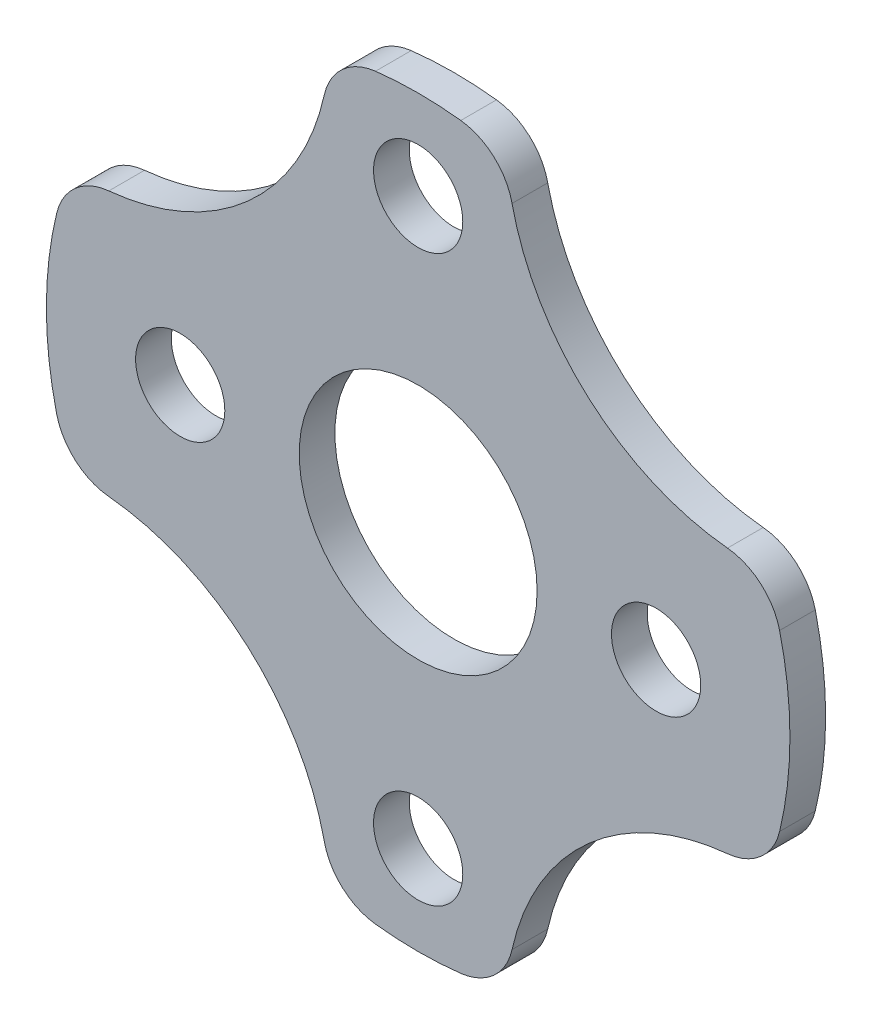
ISO-10303-21;
HEADER;
FILE_DESCRIPTION(('STEP AP214'),'2;1');
FILE_NAME('part.step','',(''),(''),'','','');
FILE_SCHEMA(('AUTOMOTIVE_DESIGN { 1 0 10303 214 1 1 1 1 }'));
ENDSEC;
DATA;
#1=APPLICATION_CONTEXT('core data for automotive mechanical design processes');
#2=APPLICATION_PROTOCOL_DEFINITION('international standard','automotive_design',2000,#1);
#3=PRODUCT_CONTEXT('',#1,'mechanical');
#4=PRODUCT('Part','Part','',(#3));
#5=PRODUCT_RELATED_PRODUCT_CATEGORY('part','',(#4));
#6=PRODUCT_DEFINITION_FORMATION('','',#4);
#7=PRODUCT_DEFINITION_CONTEXT('part definition',#1,'design');
#8=PRODUCT_DEFINITION('design','',#6,#7);
#9=PRODUCT_DEFINITION_SHAPE('','',#8);
#10=(LENGTH_UNIT() NAMED_UNIT(*) SI_UNIT(.MILLI.,.METRE.));
#11=(NAMED_UNIT(*) PLANE_ANGLE_UNIT() SI_UNIT($,.RADIAN.));
#12=(NAMED_UNIT(*) SI_UNIT($,.STERADIAN.) SOLID_ANGLE_UNIT());
#13=UNCERTAINTY_MEASURE_WITH_UNIT(LENGTH_MEASURE(1.E-05),#10,'distance_accuracy_value','');
#14=(GEOMETRIC_REPRESENTATION_CONTEXT(3) GLOBAL_UNCERTAINTY_ASSIGNED_CONTEXT((#13)) GLOBAL_UNIT_ASSIGNED_CONTEXT((#10,
#11,#12)) REPRESENTATION_CONTEXT('',''));
#15=CARTESIAN_POINT('',(0.,0.,0.));
#16=DIRECTION('',(0.,0.,1.));
#17=DIRECTION('',(1.,0.,0.));
#18=AXIS2_PLACEMENT_3D('',#15,#16,#17);
#19=CARTESIAN_POINT('',(-62.7493060624374,7.4838621909329,1.2));
#20=DIRECTION('',(0.,0.,-1.));
#21=DIRECTION('',(-1.,0.,0.));
#22=AXIS2_PLACEMENT_3D('',#19,#20,#21);
#23=CYLINDRICAL_SURFACE('',#22,12.5);
#24=CARTESIAN_POINT('',(-62.7493060624374,7.4838621909329,0.));
#25=DIRECTION('',(0.,0.,1.));
#26=DIRECTION('',(1.,0.,0.));
#27=AXIS2_PLACEMENT_3D('',#24,#25,#26);
#28=CIRCLE('',#27,12.5);
#29=CARTESIAN_POINT('',(-64.1831600083881,-4.93362800884907,0.));
#30=VERTEX_POINT('',#29);
#31=CARTESIAN_POINT('',(-61.3154521164866,-4.93362800884907,0.));
#32=VERTEX_POINT('',#31);
#33=EDGE_CURVE('E178',#30,#32,#28,.T.);
#34=ORIENTED_EDGE('',*,*,#33,.T.);
#35=DIRECTION('',(0.,0.,-1.));
#36=VECTOR('',#35,1.);
#37=CARTESIAN_POINT('',(-61.3154521164866,-4.93362800884907,1.2));
#38=LINE('',#37,#36);
#39=CARTESIAN_POINT('',(-61.3154521164866,-4.93362800884907,1.2));
#40=VERTEX_POINT('',#39);
#41=EDGE_CURVE('E259',#32,#40,#38,.F.);
#42=ORIENTED_EDGE('',*,*,#41,.T.);
#43=CARTESIAN_POINT('',(-62.7493060624374,7.4838621909329,1.2));
#44=DIRECTION('',(0.,0.,1.));
#45=DIRECTION('',(1.,0.,0.));
#46=AXIS2_PLACEMENT_3D('',#43,#44,#45);
#47=CIRCLE('',#46,12.5);
#48=CARTESIAN_POINT('',(-64.1831600083881,-4.93362800884907,1.2));
#49=VERTEX_POINT('',#48);
#50=EDGE_CURVE('E204',#49,#40,#47,.T.);
#51=ORIENTED_EDGE('',*,*,#50,.F.);
#52=DIRECTION('',(0.,0.,-1.));
#53=VECTOR('',#52,1.);
#54=CARTESIAN_POINT('',(-64.1831600083881,-4.93362800884907,1.2));
#55=LINE('',#54,#53);
#56=EDGE_CURVE('E256',#49,#30,#55,.T.);
#57=ORIENTED_EDGE('',*,*,#56,.T.);
#58=EDGE_LOOP('',(#34,#42,#51,#57));
#59=FACE_BOUND('',#58,.T.);
#60=ADVANCED_FACE('F33',(#59),#23,.T.);
#61=CARTESIAN_POINT('',(-74.9017818269291,10.4108628389414,1.2));
#62=VERTEX_POINT('',#61);
#63=CARTESIAN_POINT('',(-74.9017818269291,4.55686154292442,1.2));
#64=VERTEX_POINT('',#63);
#65=EDGE_CURVE('E169',#62,#64,#47,.T.);
#66=ORIENTED_EDGE('',*,*,#65,.F.);
#67=DIRECTION('',(0.,0.,-1.));
#68=VECTOR('',#67,1.);
#69=CARTESIAN_POINT('',(-74.9017818269291,10.4108628389414,1.2));
#70=LINE('',#69,#68);
#71=CARTESIAN_POINT('',(-74.9017818269291,10.4108628389414,0.));
#72=VERTEX_POINT('',#71);
#73=EDGE_CURVE('E152',#62,#72,#70,.T.);
#74=ORIENTED_EDGE('',*,*,#73,.T.);
#75=CARTESIAN_POINT('',(-74.9017818269291,4.55686154292442,0.));
#76=VERTEX_POINT('',#75);
#77=EDGE_CURVE('E166',#72,#76,#28,.T.);
#78=ORIENTED_EDGE('',*,*,#77,.T.);
#79=DIRECTION('',(0.,0.,-1.));
#80=VECTOR('',#79,1.);
#81=CARTESIAN_POINT('',(-74.9017818269291,4.55686154292442,1.2));
#82=LINE('',#81,#80);
#83=EDGE_CURVE('E171',#76,#64,#82,.F.);
#84=ORIENTED_EDGE('',*,*,#83,.T.);
#85=EDGE_LOOP('',(#66,#74,#78,#84));
#86=FACE_BOUND('',#85,.T.);
#87=ADVANCED_FACE('F164',(#86),#23,.T.);
#88=CARTESIAN_POINT('',(-61.3154521164866,19.9013523907149,0.));
#89=VERTEX_POINT('',#88);
#90=CARTESIAN_POINT('',(-64.1831600083881,19.9013523907149,0.));
#91=VERTEX_POINT('',#90);
#92=EDGE_CURVE('E177',#89,#91,#28,.T.);
#93=ORIENTED_EDGE('',*,*,#92,.T.);
#94=DIRECTION('',(0.,0.,-1.));
#95=VECTOR('',#94,1.);
#96=CARTESIAN_POINT('',(-64.1831600083881,19.9013523907149,1.2));
#97=LINE('',#96,#95);
#98=CARTESIAN_POINT('',(-64.1831600083881,19.9013523907149,1.2));
#99=VERTEX_POINT('',#98);
#100=EDGE_CURVE('E241',#91,#99,#97,.F.);
#101=ORIENTED_EDGE('',*,*,#100,.T.);
#102=CARTESIAN_POINT('',(-61.3154521164866,19.9013523907149,1.2));
#103=VERTEX_POINT('',#102);
#104=EDGE_CURVE('E205',#103,#99,#47,.T.);
#105=ORIENTED_EDGE('',*,*,#104,.F.);
#106=DIRECTION('',(0.,0.,-1.));
#107=VECTOR('',#106,1.);
#108=CARTESIAN_POINT('',(-61.3154521164866,19.9013523907149,1.2));
#109=LINE('',#108,#107);
#110=EDGE_CURVE('E238',#103,#89,#109,.T.);
#111=ORIENTED_EDGE('',*,*,#110,.T.);
#112=EDGE_LOOP('',(#93,#101,#105,#111));
#113=FACE_BOUND('',#112,.T.);
#114=ADVANCED_FACE('F336',(#113),#23,.T.);
#115=CARTESIAN_POINT('',(-62.7493060624374,7.4838621909329,1.2));
#116=DIRECTION('',(0.,0.,1.));
#117=DIRECTION('',(1.,0.,0.));
#118=AXIS2_PLACEMENT_3D('',#115,#116,#117);
#119=PLANE('',#118);
#120=CARTESIAN_POINT('',(-73.9402170270319,20.1229512263385,1.2));
#121=DIRECTION('',(0.,0.,1.));
#122=DIRECTION('',(1.,0.,0.));
#123=AXIS2_PLACEMENT_3D('',#120,#121,#122);
#124=CIRCLE('',#123,8.2277404373378);
#125=CARTESIAN_POINT('',(-73.1495750407483,11.9332871334877,1.2));
#126=VERTEX_POINT('',#125);
#127=CARTESIAN_POINT('',(-65.9065644739694,18.3463985643337,1.2));
#128=VERTEX_POINT('',#127);
#129=EDGE_CURVE('E277',#126,#128,#124,.T.);
#130=ORIENTED_EDGE('',*,*,#129,.F.);
#131=CARTESIAN_POINT('',(-72.9573857046104,9.94254273526002,1.2));
#132=DIRECTION('',(0.,0.,1.));
#133=DIRECTION('',(1.,0.,0.));
#134=AXIS2_PLACEMENT_3D('',#131,#132,#133);
#135=CIRCLE('',#134,2.);
#136=EDGE_CURVE('E236',#126,#62,#135,.T.);
#137=ORIENTED_EDGE('',*,*,#136,.T.);
#138=ORIENTED_EDGE('',*,*,#65,.T.);
#139=CARTESIAN_POINT('',(-72.9573857046104,5.02518164660578,1.2));
#140=DIRECTION('',(0.,0.,1.));
#141=DIRECTION('',(1.,0.,0.));
#142=AXIS2_PLACEMENT_3D('',#139,#140,#141);
#143=CIRCLE('',#142,2.);
#144=CARTESIAN_POINT('',(-73.1495750407483,3.03443724837811,1.2));
#145=VERTEX_POINT('',#144);
#146=EDGE_CURVE('E224',#64,#145,#143,.T.);
#147=ORIENTED_EDGE('',*,*,#146,.T.);
#148=CARTESIAN_POINT('',(-73.9402170270319,-5.15522684447266,1.2));
#149=DIRECTION('',(0.,0.,1.));
#150=DIRECTION('',(1.,0.,0.));
#151=AXIS2_PLACEMENT_3D('',#148,#149,#150);
#152=CIRCLE('',#151,8.2277404373378);
#153=CARTESIAN_POINT('',(-65.9065644739694,-3.37867418246793,1.2));
#154=VERTEX_POINT('',#153);
#155=EDGE_CURVE('E267',#154,#145,#152,.T.);
#156=ORIENTED_EDGE('',*,*,#155,.F.);
#157=CARTESIAN_POINT('',(-63.953743377036,-2.94682957688395,1.2));
#158=DIRECTION('',(0.,0.,1.));
#159=DIRECTION('',(1.,0.,0.));
#160=AXIS2_PLACEMENT_3D('',#157,#158,#159);
#161=CIRCLE('',#160,2.);
#162=EDGE_CURVE('E56',#154,#49,#161,.T.);
#163=ORIENTED_EDGE('',*,*,#162,.T.);
#164=ORIENTED_EDGE('',*,*,#50,.T.);
#165=CARTESIAN_POINT('',(-61.5448687478387,-2.94682957688395,1.2));
#166=DIRECTION('',(0.,0.,1.));
#167=DIRECTION('',(1.,0.,0.));
#168=AXIS2_PLACEMENT_3D('',#165,#166,#167);
#169=CIRCLE('',#168,2.);
#170=CARTESIAN_POINT('',(-59.5920476509054,-3.37867418246793,1.2));
#171=VERTEX_POINT('',#170);
#172=EDGE_CURVE('E48',#40,#171,#169,.T.);
#173=ORIENTED_EDGE('',*,*,#172,.T.);
#174=CARTESIAN_POINT('',(-51.5583950978429,-5.15522684447264,1.2));
#175=DIRECTION('',(0.,0.,1.));
#176=DIRECTION('',(1.,0.,0.));
#177=AXIS2_PLACEMENT_3D('',#174,#175,#176);
#178=CIRCLE('',#177,8.22774043733777);
#179=CARTESIAN_POINT('',(-52.3490370841264,3.0344372483781,1.2));
#180=VERTEX_POINT('',#179);
#181=EDGE_CURVE('E282',#180,#171,#178,.T.);
#182=ORIENTED_EDGE('',*,*,#181,.F.);
#183=CARTESIAN_POINT('',(-52.5412264202643,5.02518164660578,1.2));
#184=DIRECTION('',(0.,0.,1.));
#185=DIRECTION('',(1.,0.,0.));
#186=AXIS2_PLACEMENT_3D('',#183,#184,#185);
#187=CIRCLE('',#186,2.);
#188=CARTESIAN_POINT('',(-50.5968302979457,4.55686154292442,1.2));
#189=VERTEX_POINT('',#188);
#190=EDGE_CURVE('E228',#180,#189,#187,.T.);
#191=ORIENTED_EDGE('',*,*,#190,.T.);
#192=CARTESIAN_POINT('',(-50.5968302979457,10.4108628389414,1.2));
#193=VERTEX_POINT('',#192);
#194=EDGE_CURVE('E182',#189,#193,#47,.T.);
#195=ORIENTED_EDGE('',*,*,#194,.T.);
#196=CARTESIAN_POINT('',(-52.5412264202643,9.94254273526003,1.2));
#197=DIRECTION('',(0.,0.,1.));
#198=DIRECTION('',(1.,0.,0.));
#199=AXIS2_PLACEMENT_3D('',#196,#197,#198);
#200=CIRCLE('',#199,2.);
#201=CARTESIAN_POINT('',(-52.3490370841264,11.9332871334877,1.2));
#202=VERTEX_POINT('',#201);
#203=EDGE_CURVE('E230',#193,#202,#200,.T.);
#204=ORIENTED_EDGE('',*,*,#203,.T.);
#205=CARTESIAN_POINT('',(-51.5583950978429,20.1229512263385,1.2));
#206=DIRECTION('',(0.,0.,1.));
#207=DIRECTION('',(1.,0.,0.));
#208=AXIS2_PLACEMENT_3D('',#205,#206,#207);
#209=CIRCLE('',#208,8.22774043733779);
#210=CARTESIAN_POINT('',(-59.5920476509053,18.3463985643337,1.2));
#211=VERTEX_POINT('',#210);
#212=EDGE_CURVE('E280',#211,#202,#209,.T.);
#213=ORIENTED_EDGE('',*,*,#212,.F.);
#214=CARTESIAN_POINT('',(-61.5448687478387,17.9145539587498,1.2));
#215=DIRECTION('',(0.,0.,1.));
#216=DIRECTION('',(1.,0.,0.));
#217=AXIS2_PLACEMENT_3D('',#214,#215,#216);
#218=CIRCLE('',#217,2.);
#219=EDGE_CURVE('E232',#211,#103,#218,.T.);
#220=ORIENTED_EDGE('',*,*,#219,.T.);
#221=ORIENTED_EDGE('',*,*,#104,.T.);
#222=CARTESIAN_POINT('',(-63.953743377036,17.9145539587498,1.2));
#223=DIRECTION('',(0.,0.,1.));
#224=DIRECTION('',(1.,0.,0.));
#225=AXIS2_PLACEMENT_3D('',#222,#223,#224);
#226=CIRCLE('',#225,2.);
#227=EDGE_CURVE('E234',#99,#128,#226,.T.);
#228=ORIENTED_EDGE('',*,*,#227,.T.);
#229=EDGE_LOOP('',(#130,#137,#138,#147,#156,#163,#164,#173,#182,#191,#195,#204,#213,#220,#221,#228));
#230=FACE_BOUND('',#229,.T.);
#231=CARTESIAN_POINT('',(-62.7493060624374,-2.0161378090671,1.2));
#232=DIRECTION('',(0.,0.,1.));
#233=DIRECTION('',(1.,0.,0.));
#234=AXIS2_PLACEMENT_3D('',#231,#232,#233);
#235=CIRCLE('',#234,1.5);
#236=CARTESIAN_POINT('',(-61.2493060624374,-2.0161378090671,1.2));
#237=VERTEX_POINT('',#236);
#238=EDGE_CURVE('E298',#237,#237,#235,.T.);
#239=ORIENTED_EDGE('',*,*,#238,.F.);
#240=EDGE_LOOP('',(#239));
#241=FACE_BOUND('',#240,.T.);
#242=CARTESIAN_POINT('',(-54.7493060624374,7.4838621909329,1.2));
#243=DIRECTION('',(0.,0.,1.));
#244=DIRECTION('',(1.,0.,0.));
#245=AXIS2_PLACEMENT_3D('',#242,#243,#244);
#246=CIRCLE('',#245,1.5);
#247=CARTESIAN_POINT('',(-53.2493060624374,7.4838621909329,1.2));
#248=VERTEX_POINT('',#247);
#249=EDGE_CURVE('E199',#248,#248,#246,.T.);
#250=ORIENTED_EDGE('',*,*,#249,.F.);
#251=EDGE_LOOP('',(#250));
#252=FACE_BOUND('',#251,.T.);
#253=CARTESIAN_POINT('',(-70.7493060624374,7.4838621909329,1.2));
#254=DIRECTION('',(0.,0.,1.));
#255=DIRECTION('',(1.,0.,0.));
#256=AXIS2_PLACEMENT_3D('',#253,#254,#255);
#257=CIRCLE('',#256,1.5);
#258=CARTESIAN_POINT('',(-69.2493060624374,7.4838621909329,1.2));
#259=VERTEX_POINT('',#258);
#260=EDGE_CURVE('E187',#259,#259,#257,.T.);
#261=ORIENTED_EDGE('',*,*,#260,.F.);
#262=EDGE_LOOP('',(#261));
#263=FACE_BOUND('',#262,.T.);
#264=CARTESIAN_POINT('',(-62.7493060624374,16.9838621909329,1.2));
#265=DIRECTION('',(0.,0.,1.));
#266=DIRECTION('',(1.,0.,0.));
#267=AXIS2_PLACEMENT_3D('',#264,#265,#266);
#268=CIRCLE('',#267,1.5);
#269=CARTESIAN_POINT('',(-61.2493060624374,16.9838621909329,1.2));
#270=VERTEX_POINT('',#269);
#271=EDGE_CURVE('E304',#270,#270,#268,.T.);
#272=ORIENTED_EDGE('',*,*,#271,.F.);
#273=EDGE_LOOP('',(#272));
#274=FACE_BOUND('',#273,.T.);
#275=CARTESIAN_POINT('',(-62.7493060624374,7.4838621909329,1.2));
#276=DIRECTION('',(0.,0.,1.));
#277=DIRECTION('',(1.,0.,0.));
#278=AXIS2_PLACEMENT_3D('',#275,#276,#277);
#279=CIRCLE('',#278,4.00000000000001);
#280=CARTESIAN_POINT('',(-58.7493060624374,7.4838621909329,1.2));
#281=VERTEX_POINT('',#280);
#282=EDGE_CURVE('E292',#281,#281,#279,.T.);
#283=ORIENTED_EDGE('',*,*,#282,.F.);
#284=EDGE_LOOP('',(#283));
#285=FACE_BOUND('',#284,.T.);
#286=ADVANCED_FACE('F274',(#230,#241,#252,#263,#274,#285),#119,.T.);
#287=CARTESIAN_POINT('',(-62.7493060624374,7.4838621909329,0.));
#288=DIRECTION('',(0.,0.,1.));
#289=DIRECTION('',(1.,0.,0.));
#290=AXIS2_PLACEMENT_3D('',#287,#288,#289);
#291=PLANE('',#290);
#292=ORIENTED_EDGE('',*,*,#77,.F.);
#293=CARTESIAN_POINT('',(-72.9573857046104,9.94254273526002,0.));
#294=DIRECTION('',(0.,0.,1.));
#295=DIRECTION('',(1.,0.,0.));
#296=AXIS2_PLACEMENT_3D('',#293,#294,#295);
#297=CIRCLE('',#296,2.);
#298=CARTESIAN_POINT('',(-73.1495750407483,11.9332871334877,0.));
#299=VERTEX_POINT('',#298);
#300=EDGE_CURVE('E148',#72,#299,#297,.F.);
#301=ORIENTED_EDGE('',*,*,#300,.T.);
#302=CARTESIAN_POINT('',(-73.9402170270319,20.1229512263385,0.));
#303=DIRECTION('',(0.,0.,-1.));
#304=DIRECTION('',(1.,0.,0.));
#305=AXIS2_PLACEMENT_3D('',#302,#303,#304);
#306=CIRCLE('',#305,8.2277404373378);
#307=CARTESIAN_POINT('',(-65.9065644739694,18.3463985643337,0.));
#308=VERTEX_POINT('',#307);
#309=EDGE_CURVE('E270',#308,#299,#306,.T.);
#310=ORIENTED_EDGE('',*,*,#309,.F.);
#311=CARTESIAN_POINT('',(-63.953743377036,17.9145539587498,0.));
#312=DIRECTION('',(0.,0.,1.));
#313=DIRECTION('',(1.,0.,0.));
#314=AXIS2_PLACEMENT_3D('',#311,#312,#313);
#315=CIRCLE('',#314,2.);
#316=EDGE_CURVE('E159',#308,#91,#315,.F.);
#317=ORIENTED_EDGE('',*,*,#316,.T.);
#318=ORIENTED_EDGE('',*,*,#92,.F.);
#319=CARTESIAN_POINT('',(-61.5448687478387,17.9145539587498,0.));
#320=DIRECTION('',(0.,0.,1.));
#321=DIRECTION('',(1.,0.,0.));
#322=AXIS2_PLACEMENT_3D('',#319,#320,#321);
#323=CIRCLE('',#322,2.);
#324=CARTESIAN_POINT('',(-59.5920476509053,18.3463985643337,0.));
#325=VERTEX_POINT('',#324);
#326=EDGE_CURVE('E219',#89,#325,#323,.F.);
#327=ORIENTED_EDGE('',*,*,#326,.T.);
#328=CARTESIAN_POINT('',(-51.5583950978429,20.1229512263385,0.));
#329=DIRECTION('',(0.,0.,-1.));
#330=DIRECTION('',(-1.,0.,0.));
#331=AXIS2_PLACEMENT_3D('',#328,#329,#330);
#332=CIRCLE('',#331,8.22774043733779);
#333=CARTESIAN_POINT('',(-52.3490370841264,11.9332871334877,0.));
#334=VERTEX_POINT('',#333);
#335=EDGE_CURVE('E285',#334,#325,#332,.T.);
#336=ORIENTED_EDGE('',*,*,#335,.F.);
#337=CARTESIAN_POINT('',(-52.5412264202643,9.94254273526003,0.));
#338=DIRECTION('',(0.,0.,1.));
#339=DIRECTION('',(1.,0.,0.));
#340=AXIS2_PLACEMENT_3D('',#337,#338,#339);
#341=CIRCLE('',#340,2.);
#342=CARTESIAN_POINT('',(-50.5968302979457,10.4108628389414,0.));
#343=VERTEX_POINT('',#342);
#344=EDGE_CURVE('E217',#334,#343,#341,.F.);
#345=ORIENTED_EDGE('',*,*,#344,.T.);
#346=CARTESIAN_POINT('',(-50.5968302979457,4.55686154292442,0.));
#347=VERTEX_POINT('',#346);
#348=EDGE_CURVE('E180',#347,#343,#28,.T.);
#349=ORIENTED_EDGE('',*,*,#348,.F.);
#350=CARTESIAN_POINT('',(-52.5412264202643,5.02518164660578,0.));
#351=DIRECTION('',(0.,0.,1.));
#352=DIRECTION('',(1.,0.,0.));
#353=AXIS2_PLACEMENT_3D('',#350,#351,#352);
#354=CIRCLE('',#353,2.);
#355=CARTESIAN_POINT('',(-52.3490370841264,3.0344372483781,0.));
#356=VERTEX_POINT('',#355);
#357=EDGE_CURVE('E215',#347,#356,#354,.F.);
#358=ORIENTED_EDGE('',*,*,#357,.T.);
#359=CARTESIAN_POINT('',(-51.5583950978429,-5.15522684447264,0.));
#360=DIRECTION('',(0.,0.,-1.));
#361=DIRECTION('',(-1.,0.,0.));
#362=AXIS2_PLACEMENT_3D('',#359,#360,#361);
#363=CIRCLE('',#362,8.22774043733777);
#364=CARTESIAN_POINT('',(-59.5920476509054,-3.37867418246793,0.));
#365=VERTEX_POINT('',#364);
#366=EDGE_CURVE('E271',#365,#356,#363,.T.);
#367=ORIENTED_EDGE('',*,*,#366,.F.);
#368=CARTESIAN_POINT('',(-61.5448687478387,-2.94682957688395,0.));
#369=DIRECTION('',(0.,0.,1.));
#370=DIRECTION('',(1.,0.,0.));
#371=AXIS2_PLACEMENT_3D('',#368,#369,#370);
#372=CIRCLE('',#371,2.);
#373=EDGE_CURVE('E213',#365,#32,#372,.F.);
#374=ORIENTED_EDGE('',*,*,#373,.T.);
#375=ORIENTED_EDGE('',*,*,#33,.F.);
#376=CARTESIAN_POINT('',(-63.953743377036,-2.94682957688395,0.));
#377=DIRECTION('',(0.,0.,1.));
#378=DIRECTION('',(1.,0.,0.));
#379=AXIS2_PLACEMENT_3D('',#376,#377,#378);
#380=CIRCLE('',#379,2.);
#381=CARTESIAN_POINT('',(-65.9065644739694,-3.37867418246793,0.));
#382=VERTEX_POINT('',#381);
#383=EDGE_CURVE('E211',#30,#382,#380,.F.);
#384=ORIENTED_EDGE('',*,*,#383,.T.);
#385=CARTESIAN_POINT('',(-73.9402170270319,-5.15522684447266,0.));
#386=DIRECTION('',(0.,0.,-1.));
#387=DIRECTION('',(1.,0.,0.));
#388=AXIS2_PLACEMENT_3D('',#385,#386,#387);
#389=CIRCLE('',#388,8.2277404373378);
#390=CARTESIAN_POINT('',(-73.1495750407483,3.03443724837811,0.));
#391=VERTEX_POINT('',#390);
#392=EDGE_CURVE('E265',#391,#382,#389,.T.);
#393=ORIENTED_EDGE('',*,*,#392,.F.);
#394=CARTESIAN_POINT('',(-72.9573857046104,5.02518164660578,0.));
#395=DIRECTION('',(0.,0.,1.));
#396=DIRECTION('',(1.,0.,0.));
#397=AXIS2_PLACEMENT_3D('',#394,#395,#396);
#398=CIRCLE('',#397,2.);
#399=EDGE_CURVE('E170',#391,#76,#398,.F.);
#400=ORIENTED_EDGE('',*,*,#399,.T.);
#401=EDGE_LOOP('',(#292,#301,#310,#317,#318,#327,#336,#345,#349,#358,#367,#374,#375,#384,#393,#400));
#402=FACE_BOUND('',#401,.T.);
#403=CARTESIAN_POINT('',(-70.7493060624374,7.4838621909329,0.));
#404=DIRECTION('',(0.,0.,1.));
#405=DIRECTION('',(1.,0.,0.));
#406=AXIS2_PLACEMENT_3D('',#403,#404,#405);
#407=CIRCLE('',#406,1.5);
#408=CARTESIAN_POINT('',(-69.2493060624374,7.4838621909329,0.));
#409=VERTEX_POINT('',#408);
#410=EDGE_CURVE('E194',#409,#409,#407,.T.);
#411=ORIENTED_EDGE('',*,*,#410,.T.);
#412=EDGE_LOOP('',(#411));
#413=FACE_BOUND('',#412,.T.);
#414=CARTESIAN_POINT('',(-54.7493060624374,7.4838621909329,0.));
#415=DIRECTION('',(0.,0.,1.));
#416=DIRECTION('',(1.,0.,0.));
#417=AXIS2_PLACEMENT_3D('',#414,#415,#416);
#418=CIRCLE('',#417,1.5);
#419=CARTESIAN_POINT('',(-53.2493060624374,7.4838621909329,0.));
#420=VERTEX_POINT('',#419);
#421=EDGE_CURVE('E202',#420,#420,#418,.T.);
#422=ORIENTED_EDGE('',*,*,#421,.T.);
#423=EDGE_LOOP('',(#422));
#424=FACE_BOUND('',#423,.T.);
#425=CARTESIAN_POINT('',(-62.7493060624374,16.9838621909329,0.));
#426=DIRECTION('',(0.,0.,1.));
#427=DIRECTION('',(1.,0.,0.));
#428=AXIS2_PLACEMENT_3D('',#425,#426,#427);
#429=CIRCLE('',#428,1.5);
#430=CARTESIAN_POINT('',(-61.2493060624374,16.9838621909329,0.));
#431=VERTEX_POINT('',#430);
#432=EDGE_CURVE('E301',#431,#431,#429,.T.);
#433=ORIENTED_EDGE('',*,*,#432,.T.);
#434=EDGE_LOOP('',(#433));
#435=FACE_BOUND('',#434,.T.);
#436=CARTESIAN_POINT('',(-62.7493060624374,-2.0161378090671,0.));
#437=DIRECTION('',(0.,0.,1.));
#438=DIRECTION('',(1.,0.,0.));
#439=AXIS2_PLACEMENT_3D('',#436,#437,#438);
#440=CIRCLE('',#439,1.5);
#441=CARTESIAN_POINT('',(-61.2493060624374,-2.0161378090671,0.));
#442=VERTEX_POINT('',#441);
#443=EDGE_CURVE('E295',#442,#442,#440,.T.);
#444=ORIENTED_EDGE('',*,*,#443,.T.);
#445=EDGE_LOOP('',(#444));
#446=FACE_BOUND('',#445,.T.);
#447=CARTESIAN_POINT('',(-62.7493060624374,7.4838621909329,0.));
#448=DIRECTION('',(0.,0.,1.));
#449=DIRECTION('',(1.,0.,0.));
#450=AXIS2_PLACEMENT_3D('',#447,#448,#449);
#451=CIRCLE('',#450,4.00000000000001);
#452=CARTESIAN_POINT('',(-58.7493060624374,7.4838621909329,0.));
#453=VERTEX_POINT('',#452);
#454=EDGE_CURVE('E291',#453,#453,#451,.T.);
#455=ORIENTED_EDGE('',*,*,#454,.T.);
#456=EDGE_LOOP('',(#455));
#457=FACE_BOUND('',#456,.T.);
#458=ADVANCED_FACE('F173',(#402,#413,#424,#435,#446,#457),#291,.F.);
#459=ORIENTED_EDGE('',*,*,#348,.T.);
#460=DIRECTION('',(0.,0.,-1.));
#461=VECTOR('',#460,1.);
#462=CARTESIAN_POINT('',(-50.5968302979457,10.4108628389414,1.2));
#463=LINE('',#462,#461);
#464=EDGE_CURVE('E250',#343,#193,#463,.F.);
#465=ORIENTED_EDGE('',*,*,#464,.T.);
#466=ORIENTED_EDGE('',*,*,#194,.F.);
#467=DIRECTION('',(0.,0.,-1.));
#468=VECTOR('',#467,1.);
#469=CARTESIAN_POINT('',(-50.5968302979457,4.55686154292442,1.2));
#470=LINE('',#469,#468);
#471=EDGE_CURVE('E248',#189,#347,#470,.T.);
#472=ORIENTED_EDGE('',*,*,#471,.T.);
#473=EDGE_LOOP('',(#459,#465,#466,#472));
#474=FACE_BOUND('',#473,.T.);
#475=ADVANCED_FACE('F328',(#474),#23,.T.);
#476=CARTESIAN_POINT('',(-70.7493060624374,7.4838621909329,1.2));
#477=DIRECTION('',(0.,0.,-1.));
#478=DIRECTION('',(-1.,0.,0.));
#479=AXIS2_PLACEMENT_3D('',#476,#477,#478);
#480=CYLINDRICAL_SURFACE('',#479,1.5);
#481=ORIENTED_EDGE('',*,*,#260,.T.);
#482=EDGE_LOOP('',(#481));
#483=FACE_BOUND('',#482,.T.);
#484=ORIENTED_EDGE('',*,*,#410,.F.);
#485=EDGE_LOOP('',(#484));
#486=FACE_BOUND('',#485,.T.);
#487=ADVANCED_FACE('F319',(#483,#486),#480,.F.);
#488=CARTESIAN_POINT('',(-54.7493060624374,7.4838621909329,1.2));
#489=DIRECTION('',(0.,0.,-1.));
#490=DIRECTION('',(-1.,0.,0.));
#491=AXIS2_PLACEMENT_3D('',#488,#489,#490);
#492=CYLINDRICAL_SURFACE('',#491,1.5);
#493=ORIENTED_EDGE('',*,*,#249,.T.);
#494=EDGE_LOOP('',(#493));
#495=FACE_BOUND('',#494,.T.);
#496=ORIENTED_EDGE('',*,*,#421,.F.);
#497=EDGE_LOOP('',(#496));
#498=FACE_BOUND('',#497,.T.);
#499=ADVANCED_FACE('F316',(#495,#498),#492,.F.);
#500=CARTESIAN_POINT('',(-62.7493060624374,16.9838621909329,1.2));
#501=DIRECTION('',(0.,0.,-1.));
#502=DIRECTION('',(-1.,0.,0.));
#503=AXIS2_PLACEMENT_3D('',#500,#501,#502);
#504=CYLINDRICAL_SURFACE('',#503,1.5);
#505=ORIENTED_EDGE('',*,*,#271,.T.);
#506=EDGE_LOOP('',(#505));
#507=FACE_BOUND('',#506,.T.);
#508=ORIENTED_EDGE('',*,*,#432,.F.);
#509=EDGE_LOOP('',(#508));
#510=FACE_BOUND('',#509,.T.);
#511=ADVANCED_FACE('F318',(#507,#510),#504,.F.);
#512=CARTESIAN_POINT('',(-62.7493060624374,-2.0161378090671,1.2));
#513=DIRECTION('',(0.,0.,-1.));
#514=DIRECTION('',(-1.,0.,0.));
#515=AXIS2_PLACEMENT_3D('',#512,#513,#514);
#516=CYLINDRICAL_SURFACE('',#515,1.5);
#517=ORIENTED_EDGE('',*,*,#238,.T.);
#518=EDGE_LOOP('',(#517));
#519=FACE_BOUND('',#518,.T.);
#520=ORIENTED_EDGE('',*,*,#443,.F.);
#521=EDGE_LOOP('',(#520));
#522=FACE_BOUND('',#521,.T.);
#523=ADVANCED_FACE('F325',(#519,#522),#516,.F.);
#524=CARTESIAN_POINT('',(-62.7493060624374,7.4838621909329,1.2));
#525=DIRECTION('',(0.,0.,-1.));
#526=DIRECTION('',(-1.,0.,0.));
#527=AXIS2_PLACEMENT_3D('',#524,#525,#526);
#528=CYLINDRICAL_SURFACE('',#527,4.00000000000001);
#529=ORIENTED_EDGE('',*,*,#282,.T.);
#530=EDGE_LOOP('',(#529));
#531=FACE_BOUND('',#530,.T.);
#532=ORIENTED_EDGE('',*,*,#454,.F.);
#533=EDGE_LOOP('',(#532));
#534=FACE_BOUND('',#533,.T.);
#535=ADVANCED_FACE('F476',(#531,#534),#528,.F.);
#536=CARTESIAN_POINT('',(-51.5583950978429,20.1229512263385,10.));
#537=DIRECTION('',(0.,0.,-1.));
#538=DIRECTION('',(-1.,0.,0.));
#539=AXIS2_PLACEMENT_3D('',#536,#537,#538);
#540=CYLINDRICAL_SURFACE('',#539,8.22774043733779);
#541=ORIENTED_EDGE('',*,*,#335,.T.);
#542=DIRECTION('',(0.,0.,-1.));
#543=VECTOR('',#542,1.);
#544=CARTESIAN_POINT('',(-59.5920476509054,18.3463985643337,10.));
#545=LINE('',#544,#543);
#546=EDGE_CURVE('E246',#325,#211,#545,.F.);
#547=ORIENTED_EDGE('',*,*,#546,.T.);
#548=ORIENTED_EDGE('',*,*,#212,.T.);
#549=DIRECTION('',(0.,0.,-1.));
#550=VECTOR('',#549,1.);
#551=CARTESIAN_POINT('',(-52.3490370841264,11.9332871334877,10.));
#552=LINE('',#551,#550);
#553=EDGE_CURVE('E244',#202,#334,#552,.T.);
#554=ORIENTED_EDGE('',*,*,#553,.T.);
#555=EDGE_LOOP('',(#541,#547,#548,#554));
#556=FACE_BOUND('',#555,.T.);
#557=ADVANCED_FACE('F378',(#556),#540,.F.);
#558=CARTESIAN_POINT('',(-73.9402170270319,20.1229512263385,10.));
#559=DIRECTION('',(0.,0.,-1.));
#560=DIRECTION('',(-1.,0.,0.));
#561=AXIS2_PLACEMENT_3D('',#558,#559,#560);
#562=CYLINDRICAL_SURFACE('',#561,8.2277404373378);
#563=ORIENTED_EDGE('',*,*,#309,.T.);
#564=DIRECTION('',(0.,0.,-1.));
#565=VECTOR('',#564,1.);
#566=CARTESIAN_POINT('',(-73.1495750407483,11.9332871334877,10.));
#567=LINE('',#566,#565);
#568=EDGE_CURVE('E153',#299,#126,#567,.F.);
#569=ORIENTED_EDGE('',*,*,#568,.T.);
#570=ORIENTED_EDGE('',*,*,#129,.T.);
#571=DIRECTION('',(0.,0.,-1.));
#572=VECTOR('',#571,1.);
#573=CARTESIAN_POINT('',(-65.9065644739694,18.3463985643337,10.));
#574=LINE('',#573,#572);
#575=EDGE_CURVE('E158',#128,#308,#574,.T.);
#576=ORIENTED_EDGE('',*,*,#575,.T.);
#577=EDGE_LOOP('',(#563,#569,#570,#576));
#578=FACE_BOUND('',#577,.T.);
#579=ADVANCED_FACE('F355',(#578),#562,.F.);
#580=CARTESIAN_POINT('',(-73.9402170270319,-5.15522684447266,10.));
#581=DIRECTION('',(0.,0.,-1.));
#582=DIRECTION('',(-1.,0.,0.));
#583=AXIS2_PLACEMENT_3D('',#580,#581,#582);
#584=CYLINDRICAL_SURFACE('',#583,8.2277404373378);
#585=ORIENTED_EDGE('',*,*,#392,.T.);
#586=DIRECTION('',(0.,0.,-1.));
#587=VECTOR('',#586,1.);
#588=CARTESIAN_POINT('',(-65.9065644739694,-3.37867418246793,10.));
#589=LINE('',#588,#587);
#590=EDGE_CURVE('E11',#382,#154,#589,.F.);
#591=ORIENTED_EDGE('',*,*,#590,.T.);
#592=ORIENTED_EDGE('',*,*,#155,.T.);
#593=DIRECTION('',(0.,0.,-1.));
#594=VECTOR('',#593,1.);
#595=CARTESIAN_POINT('',(-73.1495750407483,3.03443724837811,10.));
#596=LINE('',#595,#594);
#597=EDGE_CURVE('E41',#145,#391,#596,.T.);
#598=ORIENTED_EDGE('',*,*,#597,.T.);
#599=EDGE_LOOP('',(#585,#591,#592,#598));
#600=FACE_BOUND('',#599,.T.);
#601=ADVANCED_FACE('F264',(#600),#584,.F.);
#602=CARTESIAN_POINT('',(-51.5583950978429,-5.15522684447264,10.));
#603=DIRECTION('',(0.,0.,-1.));
#604=DIRECTION('',(-1.,0.,0.));
#605=AXIS2_PLACEMENT_3D('',#602,#603,#604);
#606=CYLINDRICAL_SURFACE('',#605,8.22774043733777);
#607=ORIENTED_EDGE('',*,*,#366,.T.);
#608=DIRECTION('',(0.,0.,-1.));
#609=VECTOR('',#608,1.);
#610=CARTESIAN_POINT('',(-52.3490370841264,3.03443724837811,10.));
#611=LINE('',#610,#609);
#612=EDGE_CURVE('E254',#356,#180,#611,.F.);
#613=ORIENTED_EDGE('',*,*,#612,.T.);
#614=ORIENTED_EDGE('',*,*,#181,.T.);
#615=DIRECTION('',(0.,0.,-1.));
#616=VECTOR('',#615,1.);
#617=CARTESIAN_POINT('',(-59.5920476509054,-3.37867418246793,10.));
#618=LINE('',#617,#616);
#619=EDGE_CURVE('E252',#171,#365,#618,.T.);
#620=ORIENTED_EDGE('',*,*,#619,.T.);
#621=EDGE_LOOP('',(#607,#613,#614,#620));
#622=FACE_BOUND('',#621,.T.);
#623=ADVANCED_FACE('F363',(#622),#606,.F.);
#624=CARTESIAN_POINT('',(-72.9573857046104,9.94254273526002,10.));
#625=DIRECTION('',(0.,0.,1.));
#626=DIRECTION('',(1.,0.,0.));
#627=AXIS2_PLACEMENT_3D('',#624,#625,#626);
#628=CYLINDRICAL_SURFACE('',#627,2.);
#629=ORIENTED_EDGE('',*,*,#136,.F.);
#630=ORIENTED_EDGE('',*,*,#568,.F.);
#631=ORIENTED_EDGE('',*,*,#300,.F.);
#632=ORIENTED_EDGE('',*,*,#73,.F.);
#633=EDGE_LOOP('',(#629,#630,#631,#632));
#634=FACE_BOUND('',#633,.T.);
#635=ADVANCED_FACE('F151',(#634),#628,.T.);
#636=CARTESIAN_POINT('',(-63.953743377036,17.9145539587498,10.));
#637=DIRECTION('',(0.,0.,-1.));
#638=DIRECTION('',(-1.,0.,0.));
#639=AXIS2_PLACEMENT_3D('',#636,#637,#638);
#640=CYLINDRICAL_SURFACE('',#639,2.);
#641=ORIENTED_EDGE('',*,*,#316,.F.);
#642=ORIENTED_EDGE('',*,*,#575,.F.);
#643=ORIENTED_EDGE('',*,*,#227,.F.);
#644=ORIENTED_EDGE('',*,*,#100,.F.);
#645=EDGE_LOOP('',(#641,#642,#643,#644));
#646=FACE_BOUND('',#645,.T.);
#647=ADVANCED_FACE('F354',(#646),#640,.T.);
#648=CARTESIAN_POINT('',(-61.5448687478387,17.9145539587498,10.));
#649=DIRECTION('',(0.,0.,1.));
#650=DIRECTION('',(1.,0.,0.));
#651=AXIS2_PLACEMENT_3D('',#648,#649,#650);
#652=CYLINDRICAL_SURFACE('',#651,2.);
#653=ORIENTED_EDGE('',*,*,#219,.F.);
#654=ORIENTED_EDGE('',*,*,#546,.F.);
#655=ORIENTED_EDGE('',*,*,#326,.F.);
#656=ORIENTED_EDGE('',*,*,#110,.F.);
#657=EDGE_LOOP('',(#653,#654,#655,#656));
#658=FACE_BOUND('',#657,.T.);
#659=ADVANCED_FACE('F382',(#658),#652,.T.);
#660=CARTESIAN_POINT('',(-52.5412264202643,9.94254273526003,10.));
#661=DIRECTION('',(0.,0.,-1.));
#662=DIRECTION('',(-1.,0.,0.));
#663=AXIS2_PLACEMENT_3D('',#660,#661,#662);
#664=CYLINDRICAL_SURFACE('',#663,2.);
#665=ORIENTED_EDGE('',*,*,#344,.F.);
#666=ORIENTED_EDGE('',*,*,#553,.F.);
#667=ORIENTED_EDGE('',*,*,#203,.F.);
#668=ORIENTED_EDGE('',*,*,#464,.F.);
#669=EDGE_LOOP('',(#665,#666,#667,#668));
#670=FACE_BOUND('',#669,.T.);
#671=ADVANCED_FACE('F373',(#670),#664,.T.);
#672=CARTESIAN_POINT('',(-52.5412264202643,5.02518164660578,10.));
#673=DIRECTION('',(0.,0.,1.));
#674=DIRECTION('',(1.,0.,0.));
#675=AXIS2_PLACEMENT_3D('',#672,#673,#674);
#676=CYLINDRICAL_SURFACE('',#675,2.);
#677=ORIENTED_EDGE('',*,*,#190,.F.);
#678=ORIENTED_EDGE('',*,*,#612,.F.);
#679=ORIENTED_EDGE('',*,*,#357,.F.);
#680=ORIENTED_EDGE('',*,*,#471,.F.);
#681=EDGE_LOOP('',(#677,#678,#679,#680));
#682=FACE_BOUND('',#681,.T.);
#683=ADVANCED_FACE('F368',(#682),#676,.T.);
#684=CARTESIAN_POINT('',(-61.5448687478387,-2.94682957688395,10.));
#685=DIRECTION('',(0.,0.,-1.));
#686=DIRECTION('',(-1.,0.,0.));
#687=AXIS2_PLACEMENT_3D('',#684,#685,#686);
#688=CYLINDRICAL_SURFACE('',#687,2.);
#689=ORIENTED_EDGE('',*,*,#373,.F.);
#690=ORIENTED_EDGE('',*,*,#619,.F.);
#691=ORIENTED_EDGE('',*,*,#172,.F.);
#692=ORIENTED_EDGE('',*,*,#41,.F.);
#693=EDGE_LOOP('',(#689,#690,#691,#692));
#694=FACE_BOUND('',#693,.T.);
#695=ADVANCED_FACE('F394',(#694),#688,.T.);
#696=CARTESIAN_POINT('',(-63.953743377036,-2.94682957688395,10.));
#697=DIRECTION('',(0.,0.,1.));
#698=DIRECTION('',(1.,0.,0.));
#699=AXIS2_PLACEMENT_3D('',#696,#697,#698);
#700=CYLINDRICAL_SURFACE('',#699,2.);
#701=ORIENTED_EDGE('',*,*,#162,.F.);
#702=ORIENTED_EDGE('',*,*,#590,.F.);
#703=ORIENTED_EDGE('',*,*,#383,.F.);
#704=ORIENTED_EDGE('',*,*,#56,.F.);
#705=EDGE_LOOP('',(#701,#702,#703,#704));
#706=FACE_BOUND('',#705,.T.);
#707=ADVANCED_FACE('F396',(#706),#700,.T.);
#708=CARTESIAN_POINT('',(-72.9573857046104,5.02518164660578,10.));
#709=DIRECTION('',(0.,0.,-1.));
#710=DIRECTION('',(-1.,0.,0.));
#711=AXIS2_PLACEMENT_3D('',#708,#709,#710);
#712=CYLINDRICAL_SURFACE('',#711,2.);
#713=ORIENTED_EDGE('',*,*,#399,.F.);
#714=ORIENTED_EDGE('',*,*,#597,.F.);
#715=ORIENTED_EDGE('',*,*,#146,.F.);
#716=ORIENTED_EDGE('',*,*,#83,.F.);
#717=EDGE_LOOP('',(#713,#714,#715,#716));
#718=FACE_BOUND('',#717,.T.);
#719=ADVANCED_FACE('F35',(#718),#712,.T.);
#720=CLOSED_SHELL('',(#60,#87,#114,#286,#458,#475,#487,#499,#511,#523,#535,#557,#579,#601,#623,
#635,#647,#659,#671,#683,#695,#707,#719));
#721=MANIFOLD_SOLID_BREP('B2',#720);
#722=ADVANCED_BREP_SHAPE_REPRESENTATION('',(#18,#721),#14);
#723=SHAPE_DEFINITION_REPRESENTATION(#9,#722);
ENDSEC;
END-ISO-10303-21;
